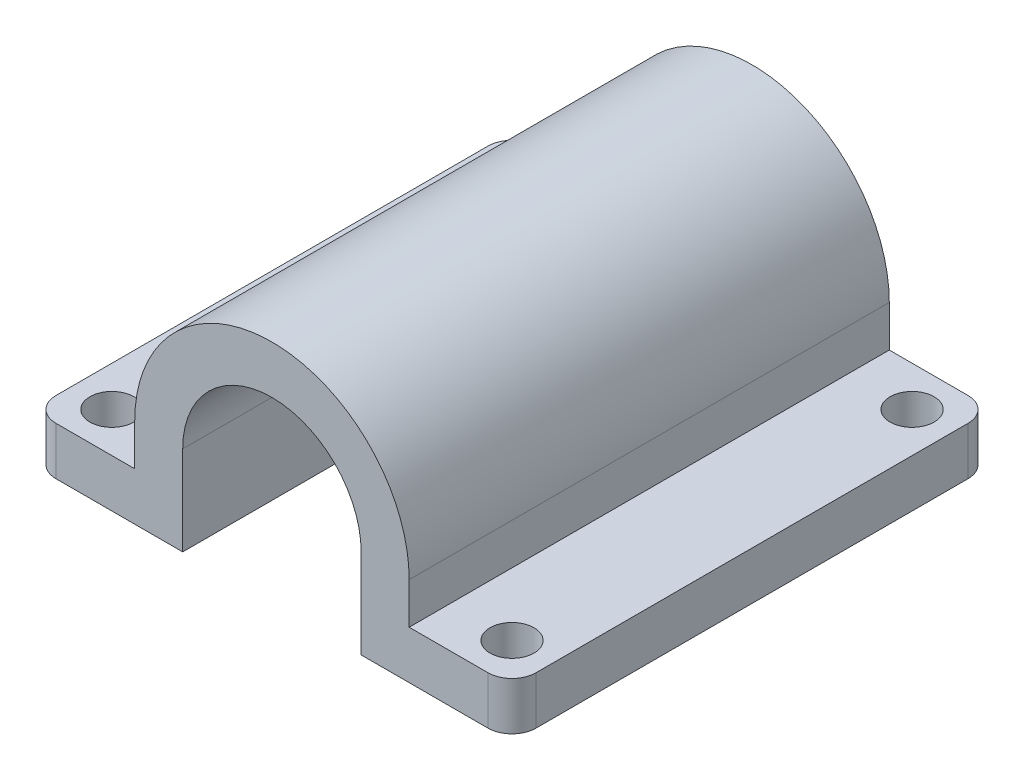
ISO-10303-21;
HEADER;
FILE_DESCRIPTION(('STEP AP214'),'2;1');
FILE_NAME('part.step','',(''),(''),'','','');
FILE_SCHEMA(('AUTOMOTIVE_DESIGN { 1 0 10303 214 1 1 1 1 }'));
ENDSEC;
DATA;
#1=APPLICATION_CONTEXT('core data for automotive mechanical design processes');
#2=APPLICATION_PROTOCOL_DEFINITION('international standard','automotive_design',2000,#1);
#3=PRODUCT_CONTEXT('',#1,'mechanical');
#4=PRODUCT('Part','Part','',(#3));
#5=PRODUCT_RELATED_PRODUCT_CATEGORY('part','',(#4));
#6=PRODUCT_DEFINITION_FORMATION('','',#4);
#7=PRODUCT_DEFINITION_CONTEXT('part definition',#1,'design');
#8=PRODUCT_DEFINITION('design','',#6,#7);
#9=PRODUCT_DEFINITION_SHAPE('','',#8);
#10=(LENGTH_UNIT() NAMED_UNIT(*) SI_UNIT(.MILLI.,.METRE.));
#11=(NAMED_UNIT(*) PLANE_ANGLE_UNIT() SI_UNIT($,.RADIAN.));
#12=(NAMED_UNIT(*) SI_UNIT($,.STERADIAN.) SOLID_ANGLE_UNIT());
#13=UNCERTAINTY_MEASURE_WITH_UNIT(LENGTH_MEASURE(1.E-05),#10,'distance_accuracy_value','');
#14=(GEOMETRIC_REPRESENTATION_CONTEXT(3) GLOBAL_UNCERTAINTY_ASSIGNED_CONTEXT((#13)) GLOBAL_UNIT_ASSIGNED_CONTEXT((#10,
#11,#12)) REPRESENTATION_CONTEXT('',''));
#15=CARTESIAN_POINT('',(0.,0.,0.));
#16=DIRECTION('',(0.,0.,1.));
#17=DIRECTION('',(1.,0.,0.));
#18=AXIS2_PLACEMENT_3D('',#15,#16,#17);
#19=CARTESIAN_POINT('',(0.,0.,60.));
#20=DIRECTION('',(0.,0.,-1.));
#21=DIRECTION('',(-1.,0.,0.));
#22=AXIS2_PLACEMENT_3D('',#19,#20,#21);
#23=CYLINDRICAL_SURFACE('',#22,11.15);
#24=CARTESIAN_POINT('',(0.,0.,0.));
#25=DIRECTION('',(0.,0.,-1.));
#26=DIRECTION('',(1.,0.,0.));
#27=AXIS2_PLACEMENT_3D('',#24,#25,#26);
#28=CIRCLE('',#27,11.15);
#29=CARTESIAN_POINT('',(-11.15,0.,0.));
#30=VERTEX_POINT('',#29);
#31=CARTESIAN_POINT('',(11.15,0.,0.));
#32=VERTEX_POINT('',#31);
#33=EDGE_CURVE('E172',#30,#32,#28,.T.);
#34=ORIENTED_EDGE('',*,*,#33,.T.);
#35=DIRECTION('',(0.,0.,-1.));
#36=VECTOR('',#35,1.);
#37=CARTESIAN_POINT('',(11.15,0.,60.));
#38=LINE('',#37,#36);
#39=CARTESIAN_POINT('',(11.15,0.,60.));
#40=VERTEX_POINT('',#39);
#41=EDGE_CURVE('E152',#40,#32,#38,.T.);
#42=ORIENTED_EDGE('',*,*,#41,.F.);
#43=CARTESIAN_POINT('',(0.,0.,60.));
#44=DIRECTION('',(0.,0.,-1.));
#45=DIRECTION('',(1.,0.,0.));
#46=AXIS2_PLACEMENT_3D('',#43,#44,#45);
#47=CIRCLE('',#46,11.15);
#48=CARTESIAN_POINT('',(-11.15,0.,60.));
#49=VERTEX_POINT('',#48);
#50=EDGE_CURVE('E160',#49,#40,#47,.T.);
#51=ORIENTED_EDGE('',*,*,#50,.F.);
#52=DIRECTION('',(0.,0.,-1.));
#53=VECTOR('',#52,1.);
#54=CARTESIAN_POINT('',(-11.15,0.,60.));
#55=LINE('',#54,#53);
#56=EDGE_CURVE('E223',#49,#30,#55,.T.);
#57=ORIENTED_EDGE('',*,*,#56,.T.);
#58=EDGE_LOOP('',(#34,#42,#51,#57));
#59=FACE_BOUND('',#58,.T.);
#60=ADVANCED_FACE('F35',(#59),#23,.F.);
#61=CARTESIAN_POINT('',(11.15,-11.15,60.));
#62=DIRECTION('',(1.,0.,0.));
#63=DIRECTION('',(0.,0.,-1.));
#64=AXIS2_PLACEMENT_3D('',#61,#62,#63);
#65=PLANE('',#64);
#66=DIRECTION('',(0.,-1.,0.));
#67=VECTOR('',#66,1.);
#68=CARTESIAN_POINT('',(11.15,-11.15,0.));
#69=LINE('',#68,#67);
#70=CARTESIAN_POINT('',(11.15,-11.15,0.));
#71=VERTEX_POINT('',#70);
#72=EDGE_CURVE('E269',#32,#71,#69,.T.);
#73=ORIENTED_EDGE('',*,*,#72,.T.);
#74=DIRECTION('',(0.,0.,-1.));
#75=VECTOR('',#74,1.);
#76=CARTESIAN_POINT('',(11.15,-11.15,60.));
#77=LINE('',#76,#75);
#78=CARTESIAN_POINT('',(11.15,-11.15,60.));
#79=VERTEX_POINT('',#78);
#80=EDGE_CURVE('E155',#79,#71,#77,.T.);
#81=ORIENTED_EDGE('',*,*,#80,.F.);
#82=DIRECTION('',(0.,-1.,0.));
#83=VECTOR('',#82,1.);
#84=CARTESIAN_POINT('',(11.15,-11.15,60.));
#85=LINE('',#84,#83);
#86=EDGE_CURVE('E148',#40,#79,#85,.T.);
#87=ORIENTED_EDGE('',*,*,#86,.F.);
#88=ORIENTED_EDGE('',*,*,#41,.T.);
#89=EDGE_LOOP('',(#73,#81,#87,#88));
#90=FACE_BOUND('',#89,.T.);
#91=ADVANCED_FACE('F150',(#90),#65,.F.);
#92=CARTESIAN_POINT('',(11.15,-11.15,60.));
#93=DIRECTION('',(0.,1.,0.));
#94=DIRECTION('',(-1.,0.,0.));
#95=AXIS2_PLACEMENT_3D('',#92,#93,#94);
#96=PLANE('',#95);
#97=CARTESIAN_POINT('',(25.,-11.15,5.));
#98=DIRECTION('',(0.,1.,0.));
#99=DIRECTION('',(0.,0.,-1.));
#100=AXIS2_PLACEMENT_3D('',#97,#98,#99);
#101=CIRCLE('',#100,2.75);
#102=CARTESIAN_POINT('',(25.,-11.15,2.25));
#103=VERTEX_POINT('',#102);
#104=EDGE_CURVE('E371',#103,#103,#101,.T.);
#105=ORIENTED_EDGE('',*,*,#104,.T.);
#106=EDGE_LOOP('',(#105));
#107=FACE_BOUND('',#106,.T.);
#108=CARTESIAN_POINT('',(25.,-11.15,55.));
#109=DIRECTION('',(0.,1.,0.));
#110=DIRECTION('',(0.,0.,1.));
#111=AXIS2_PLACEMENT_3D('',#108,#109,#110);
#112=CIRCLE('',#111,2.75);
#113=CARTESIAN_POINT('',(25.,-11.15,57.75));
#114=VERTEX_POINT('',#113);
#115=EDGE_CURVE('E374',#114,#114,#112,.T.);
#116=ORIENTED_EDGE('',*,*,#115,.T.);
#117=EDGE_LOOP('',(#116));
#118=FACE_BOUND('',#117,.T.);
#119=DIRECTION('',(1.,0.,0.));
#120=VECTOR('',#119,1.);
#121=CARTESIAN_POINT('',(11.15,-11.15,0.));
#122=LINE('',#121,#120);
#123=CARTESIAN_POINT('',(27.,-11.15,0.));
#124=VERTEX_POINT('',#123);
#125=EDGE_CURVE('E265',#71,#124,#122,.T.);
#126=ORIENTED_EDGE('',*,*,#125,.T.);
#127=CARTESIAN_POINT('',(27.,-11.15,3.));
#128=DIRECTION('',(0.,1.,0.));
#129=DIRECTION('',(-1.,0.,0.));
#130=AXIS2_PLACEMENT_3D('',#127,#128,#129);
#131=CIRCLE('',#130,3.);
#132=CARTESIAN_POINT('',(30.,-11.15,3.00000000000002));
#133=VERTEX_POINT('',#132);
#134=EDGE_CURVE('E193',#124,#133,#131,.F.);
#135=ORIENTED_EDGE('',*,*,#134,.T.);
#136=DIRECTION('',(0.,0.,-1.));
#137=VECTOR('',#136,1.);
#138=CARTESIAN_POINT('',(30.,-11.15,60.));
#139=LINE('',#138,#137);
#140=CARTESIAN_POINT('',(30.,-11.15,57.));
#141=VERTEX_POINT('',#140);
#142=EDGE_CURVE('E177',#141,#133,#139,.T.);
#143=ORIENTED_EDGE('',*,*,#142,.F.);
#144=CARTESIAN_POINT('',(27.,-11.15,57.));
#145=DIRECTION('',(0.,1.,0.));
#146=DIRECTION('',(-1.,0.,0.));
#147=AXIS2_PLACEMENT_3D('',#144,#145,#146);
#148=CIRCLE('',#147,3.);
#149=CARTESIAN_POINT('',(27.,-11.15,60.));
#150=VERTEX_POINT('',#149);
#151=EDGE_CURVE('E191',#141,#150,#148,.F.);
#152=ORIENTED_EDGE('',*,*,#151,.T.);
#153=DIRECTION('',(1.,0.,0.));
#154=VECTOR('',#153,1.);
#155=CARTESIAN_POINT('',(11.15,-11.15,60.));
#156=LINE('',#155,#154);
#157=EDGE_CURVE('E159',#79,#150,#156,.T.);
#158=ORIENTED_EDGE('',*,*,#157,.F.);
#159=ORIENTED_EDGE('',*,*,#80,.T.);
#160=EDGE_LOOP('',(#126,#135,#143,#152,#158,#159));
#161=FACE_BOUND('',#160,.T.);
#162=ADVANCED_FACE('F287',(#107,#118,#161),#96,.F.);
#163=CARTESIAN_POINT('',(30.,-11.15,60.));
#164=DIRECTION('',(-1.,0.,0.));
#165=DIRECTION('',(0.,0.,1.));
#166=AXIS2_PLACEMENT_3D('',#163,#164,#165);
#167=PLANE('',#166);
#168=ORIENTED_EDGE('',*,*,#142,.T.);
#169=DIRECTION('',(0.,1.,0.));
#170=VECTOR('',#169,1.);
#171=CARTESIAN_POINT('',(30.,-11.15,3.));
#172=LINE('',#171,#170);
#173=CARTESIAN_POINT('',(30.,-5.15,3.00000000000002));
#174=VERTEX_POINT('',#173);
#175=EDGE_CURVE('E175',#133,#174,#172,.T.);
#176=ORIENTED_EDGE('',*,*,#175,.T.);
#177=DIRECTION('',(0.,0.,-1.));
#178=VECTOR('',#177,1.);
#179=CARTESIAN_POINT('',(30.,-5.15,60.));
#180=LINE('',#179,#178);
#181=CARTESIAN_POINT('',(30.,-5.15,57.));
#182=VERTEX_POINT('',#181);
#183=EDGE_CURVE('E238',#182,#174,#180,.T.);
#184=ORIENTED_EDGE('',*,*,#183,.F.);
#185=DIRECTION('',(0.,1.,0.));
#186=VECTOR('',#185,1.);
#187=CARTESIAN_POINT('',(30.,-11.15,57.));
#188=LINE('',#187,#186);
#189=EDGE_CURVE('E173',#182,#141,#188,.F.);
#190=ORIENTED_EDGE('',*,*,#189,.T.);
#191=EDGE_LOOP('',(#168,#176,#184,#190));
#192=FACE_BOUND('',#191,.T.);
#193=ADVANCED_FACE('F244',(#192),#167,.F.);
#194=CARTESIAN_POINT('',(30.,-5.15,60.));
#195=DIRECTION('',(0.,-1.,0.));
#196=DIRECTION('',(0.,0.,-1.));
#197=AXIS2_PLACEMENT_3D('',#194,#195,#196);
#198=PLANE('',#197);
#199=CARTESIAN_POINT('',(25.,-5.15,5.));
#200=DIRECTION('',(0.,1.,0.));
#201=DIRECTION('',(0.,0.,-1.));
#202=AXIS2_PLACEMENT_3D('',#199,#200,#201);
#203=CIRCLE('',#202,2.75);
#204=CARTESIAN_POINT('',(25.,-5.15,2.25));
#205=VERTEX_POINT('',#204);
#206=EDGE_CURVE('E387',#205,#205,#203,.T.);
#207=ORIENTED_EDGE('',*,*,#206,.F.);
#208=EDGE_LOOP('',(#207));
#209=FACE_BOUND('',#208,.T.);
#210=CARTESIAN_POINT('',(25.,-5.15,55.));
#211=DIRECTION('',(0.,1.,0.));
#212=DIRECTION('',(0.,0.,1.));
#213=AXIS2_PLACEMENT_3D('',#210,#211,#212);
#214=CIRCLE('',#213,2.75);
#215=CARTESIAN_POINT('',(25.,-5.15,57.75));
#216=VERTEX_POINT('',#215);
#217=EDGE_CURVE('E377',#216,#216,#214,.T.);
#218=ORIENTED_EDGE('',*,*,#217,.F.);
#219=EDGE_LOOP('',(#218));
#220=FACE_BOUND('',#219,.T.);
#221=ORIENTED_EDGE('',*,*,#183,.T.);
#222=CARTESIAN_POINT('',(27.,-5.15,3.));
#223=DIRECTION('',(0.,-1.,0.));
#224=DIRECTION('',(0.,0.,-1.));
#225=AXIS2_PLACEMENT_3D('',#222,#223,#224);
#226=CIRCLE('',#225,3.);
#227=CARTESIAN_POINT('',(27.,-5.15,0.));
#228=VERTEX_POINT('',#227);
#229=EDGE_CURVE('E185',#174,#228,#226,.F.);
#230=ORIENTED_EDGE('',*,*,#229,.T.);
#231=DIRECTION('',(-1.,0.,0.));
#232=VECTOR('',#231,1.);
#233=CARTESIAN_POINT('',(30.,-5.15,0.));
#234=LINE('',#233,#232);
#235=CARTESIAN_POINT('',(17.15,-5.15,0.));
#236=VERTEX_POINT('',#235);
#237=EDGE_CURVE('E257',#228,#236,#234,.T.);
#238=ORIENTED_EDGE('',*,*,#237,.T.);
#239=DIRECTION('',(0.,0.,-1.));
#240=VECTOR('',#239,1.);
#241=CARTESIAN_POINT('',(17.15,-5.15,60.));
#242=LINE('',#241,#240);
#243=CARTESIAN_POINT('',(17.15,-5.15,60.));
#244=VERTEX_POINT('',#243);
#245=EDGE_CURVE('E235',#244,#236,#242,.T.);
#246=ORIENTED_EDGE('',*,*,#245,.F.);
#247=DIRECTION('',(-1.,0.,0.));
#248=VECTOR('',#247,1.);
#249=CARTESIAN_POINT('',(30.,-5.15,60.));
#250=LINE('',#249,#248);
#251=CARTESIAN_POINT('',(27.,-5.15,60.));
#252=VERTEX_POINT('',#251);
#253=EDGE_CURVE('E289',#252,#244,#250,.T.);
#254=ORIENTED_EDGE('',*,*,#253,.F.);
#255=CARTESIAN_POINT('',(27.,-5.15,57.));
#256=DIRECTION('',(0.,-1.,0.));
#257=DIRECTION('',(0.,0.,-1.));
#258=AXIS2_PLACEMENT_3D('',#255,#256,#257);
#259=CIRCLE('',#258,3.);
#260=EDGE_CURVE('E183',#252,#182,#259,.F.);
#261=ORIENTED_EDGE('',*,*,#260,.T.);
#262=EDGE_LOOP('',(#221,#230,#238,#246,#254,#261));
#263=FACE_BOUND('',#262,.T.);
#264=ADVANCED_FACE('F255',(#209,#220,#263),#198,.F.);
#265=CARTESIAN_POINT('',(17.15,-5.15,60.));
#266=DIRECTION('',(-1.,0.,0.));
#267=DIRECTION('',(0.,0.,1.));
#268=AXIS2_PLACEMENT_3D('',#265,#266,#267);
#269=PLANE('',#268);
#270=DIRECTION('',(0.,1.,0.));
#271=VECTOR('',#270,1.);
#272=CARTESIAN_POINT('',(17.15,-5.15,0.));
#273=LINE('',#272,#271);
#274=CARTESIAN_POINT('',(17.15,0.,0.));
#275=VERTEX_POINT('',#274);
#276=EDGE_CURVE('E264',#236,#275,#273,.T.);
#277=ORIENTED_EDGE('',*,*,#276,.T.);
#278=DIRECTION('',(0.,0.,-1.));
#279=VECTOR('',#278,1.);
#280=CARTESIAN_POINT('',(17.15,0.,60.));
#281=LINE('',#280,#279);
#282=CARTESIAN_POINT('',(17.15,0.,60.));
#283=VERTEX_POINT('',#282);
#284=EDGE_CURVE('E232',#283,#275,#281,.T.);
#285=ORIENTED_EDGE('',*,*,#284,.F.);
#286=DIRECTION('',(0.,1.,0.));
#287=VECTOR('',#286,1.);
#288=CARTESIAN_POINT('',(17.15,-5.15,60.));
#289=LINE('',#288,#287);
#290=EDGE_CURVE('E291',#244,#283,#289,.T.);
#291=ORIENTED_EDGE('',*,*,#290,.F.);
#292=ORIENTED_EDGE('',*,*,#245,.T.);
#293=EDGE_LOOP('',(#277,#285,#291,#292));
#294=FACE_BOUND('',#293,.T.);
#295=ADVANCED_FACE('F351',(#294),#269,.F.);
#296=CARTESIAN_POINT('',(0.,0.,60.));
#297=DIRECTION('',(0.,0.,-1.));
#298=DIRECTION('',(-1.,0.,0.));
#299=AXIS2_PLACEMENT_3D('',#296,#297,#298);
#300=CYLINDRICAL_SURFACE('',#299,17.15);
#301=CARTESIAN_POINT('',(0.,0.,0.));
#302=DIRECTION('',(0.,0.,1.));
#303=DIRECTION('',(1.,0.,0.));
#304=AXIS2_PLACEMENT_3D('',#301,#302,#303);
#305=CIRCLE('',#304,17.15);
#306=CARTESIAN_POINT('',(-17.15,0.,0.));
#307=VERTEX_POINT('',#306);
#308=EDGE_CURVE('E267',#275,#307,#305,.T.);
#309=ORIENTED_EDGE('',*,*,#308,.T.);
#310=DIRECTION('',(0.,0.,-1.));
#311=VECTOR('',#310,1.);
#312=CARTESIAN_POINT('',(-17.15,0.,60.));
#313=LINE('',#312,#311);
#314=CARTESIAN_POINT('',(-17.15,0.,60.));
#315=VERTEX_POINT('',#314);
#316=EDGE_CURVE('E229',#315,#307,#313,.T.);
#317=ORIENTED_EDGE('',*,*,#316,.F.);
#318=CARTESIAN_POINT('',(0.,0.,60.));
#319=DIRECTION('',(0.,0.,1.));
#320=DIRECTION('',(1.,0.,0.));
#321=AXIS2_PLACEMENT_3D('',#318,#319,#320);
#322=CIRCLE('',#321,17.15);
#323=EDGE_CURVE('E295',#283,#315,#322,.T.);
#324=ORIENTED_EDGE('',*,*,#323,.F.);
#325=ORIENTED_EDGE('',*,*,#284,.T.);
#326=EDGE_LOOP('',(#309,#317,#324,#325));
#327=FACE_BOUND('',#326,.T.);
#328=ADVANCED_FACE('F316',(#327),#300,.T.);
#329=CARTESIAN_POINT('',(-17.15,-5.15,60.));
#330=DIRECTION('',(1.,0.,0.));
#331=DIRECTION('',(0.,0.,-1.));
#332=AXIS2_PLACEMENT_3D('',#329,#330,#331);
#333=PLANE('',#332);
#334=DIRECTION('',(0.,-1.,0.));
#335=VECTOR('',#334,1.);
#336=CARTESIAN_POINT('',(-17.15,-5.15,0.));
#337=LINE('',#336,#335);
#338=CARTESIAN_POINT('',(-17.15,-5.15,0.));
#339=VERTEX_POINT('',#338);
#340=EDGE_CURVE('E274',#307,#339,#337,.T.);
#341=ORIENTED_EDGE('',*,*,#340,.T.);
#342=DIRECTION('',(0.,0.,-1.));
#343=VECTOR('',#342,1.);
#344=CARTESIAN_POINT('',(-17.15,-5.15,60.));
#345=LINE('',#344,#343);
#346=CARTESIAN_POINT('',(-17.15,-5.15,60.));
#347=VERTEX_POINT('',#346);
#348=EDGE_CURVE('E220',#347,#339,#345,.T.);
#349=ORIENTED_EDGE('',*,*,#348,.F.);
#350=DIRECTION('',(0.,-1.,0.));
#351=VECTOR('',#350,1.);
#352=CARTESIAN_POINT('',(-17.15,-5.15,60.));
#353=LINE('',#352,#351);
#354=EDGE_CURVE('E297',#315,#347,#353,.T.);
#355=ORIENTED_EDGE('',*,*,#354,.F.);
#356=ORIENTED_EDGE('',*,*,#316,.T.);
#357=EDGE_LOOP('',(#341,#349,#355,#356));
#358=FACE_BOUND('',#357,.T.);
#359=ADVANCED_FACE('F308',(#358),#333,.F.);
#360=CARTESIAN_POINT('',(-30.,-5.15,60.));
#361=DIRECTION('',(0.,-1.,0.));
#362=DIRECTION('',(0.,0.,-1.));
#363=AXIS2_PLACEMENT_3D('',#360,#361,#362);
#364=PLANE('',#363);
#365=CARTESIAN_POINT('',(-25.,-5.15,55.));
#366=DIRECTION('',(0.,1.,0.));
#367=DIRECTION('',(0.,0.,-1.));
#368=AXIS2_PLACEMENT_3D('',#365,#366,#367);
#369=CIRCLE('',#368,2.75);
#370=CARTESIAN_POINT('',(-25.,-5.15,52.25));
#371=VERTEX_POINT('',#370);
#372=EDGE_CURVE('E376',#371,#371,#369,.T.);
#373=ORIENTED_EDGE('',*,*,#372,.F.);
#374=EDGE_LOOP('',(#373));
#375=FACE_BOUND('',#374,.T.);
#376=CARTESIAN_POINT('',(-25.,-5.15,5.));
#377=DIRECTION('',(0.,1.,0.));
#378=DIRECTION('',(0.,0.,1.));
#379=AXIS2_PLACEMENT_3D('',#376,#377,#378);
#380=CIRCLE('',#379,2.75);
#381=CARTESIAN_POINT('',(-25.,-5.15,7.75));
#382=VERTEX_POINT('',#381);
#383=EDGE_CURVE('E392',#382,#382,#380,.T.);
#384=ORIENTED_EDGE('',*,*,#383,.F.);
#385=EDGE_LOOP('',(#384));
#386=FACE_BOUND('',#385,.T.);
#387=DIRECTION('',(0.,0.,-1.));
#388=VECTOR('',#387,1.);
#389=CARTESIAN_POINT('',(-30.,-5.15,60.));
#390=LINE('',#389,#388);
#391=CARTESIAN_POINT('',(-30.,-5.15,57.));
#392=VERTEX_POINT('',#391);
#393=CARTESIAN_POINT('',(-30.,-5.15,3.00000000000002));
#394=VERTEX_POINT('',#393);
#395=EDGE_CURVE('E212',#392,#394,#390,.T.);
#396=ORIENTED_EDGE('',*,*,#395,.F.);
#397=CARTESIAN_POINT('',(-27.,-5.15,57.));
#398=DIRECTION('',(0.,-1.,0.));
#399=DIRECTION('',(0.,0.,-1.));
#400=AXIS2_PLACEMENT_3D('',#397,#398,#399);
#401=CIRCLE('',#400,3.);
#402=CARTESIAN_POINT('',(-27.,-5.15,60.));
#403=VERTEX_POINT('',#402);
#404=EDGE_CURVE('E11',#392,#403,#401,.F.);
#405=ORIENTED_EDGE('',*,*,#404,.T.);
#406=DIRECTION('',(-1.,0.,0.));
#407=VECTOR('',#406,1.);
#408=CARTESIAN_POINT('',(-30.,-5.15,60.));
#409=LINE('',#408,#407);
#410=EDGE_CURVE('E282',#347,#403,#409,.T.);
#411=ORIENTED_EDGE('',*,*,#410,.F.);
#412=ORIENTED_EDGE('',*,*,#348,.T.);
#413=DIRECTION('',(-1.,0.,0.));
#414=VECTOR('',#413,1.);
#415=CARTESIAN_POINT('',(-30.,-5.15,0.));
#416=LINE('',#415,#414);
#417=CARTESIAN_POINT('',(-27.,-5.15,0.));
#418=VERTEX_POINT('',#417);
#419=EDGE_CURVE('E276',#339,#418,#416,.T.);
#420=ORIENTED_EDGE('',*,*,#419,.T.);
#421=CARTESIAN_POINT('',(-27.,-5.15,3.));
#422=DIRECTION('',(0.,-1.,0.));
#423=DIRECTION('',(0.,0.,-1.));
#424=AXIS2_PLACEMENT_3D('',#421,#422,#423);
#425=CIRCLE('',#424,3.);
#426=EDGE_CURVE('E43',#418,#394,#425,.F.);
#427=ORIENTED_EDGE('',*,*,#426,.T.);
#428=EDGE_LOOP('',(#396,#405,#411,#412,#420,#427));
#429=FACE_BOUND('',#428,.T.);
#430=ADVANCED_FACE('F306',(#375,#386,#429),#364,.F.);
#431=CARTESIAN_POINT('',(-30.,-11.15,60.));
#432=DIRECTION('',(1.,0.,0.));
#433=DIRECTION('',(0.,0.,-1.));
#434=AXIS2_PLACEMENT_3D('',#431,#432,#433);
#435=PLANE('',#434);
#436=DIRECTION('',(0.,0.,-1.));
#437=VECTOR('',#436,1.);
#438=CARTESIAN_POINT('',(-30.,-11.15,60.));
#439=LINE('',#438,#437);
#440=CARTESIAN_POINT('',(-30.,-11.15,57.));
#441=VERTEX_POINT('',#440);
#442=CARTESIAN_POINT('',(-30.,-11.15,3.00000000000002));
#443=VERTEX_POINT('',#442);
#444=EDGE_CURVE('E211',#441,#443,#439,.T.);
#445=ORIENTED_EDGE('',*,*,#444,.F.);
#446=DIRECTION('',(0.,-1.,0.));
#447=VECTOR('',#446,1.);
#448=CARTESIAN_POINT('',(-30.,-5.15,57.));
#449=LINE('',#448,#447);
#450=EDGE_CURVE('E56',#441,#392,#449,.F.);
#451=ORIENTED_EDGE('',*,*,#450,.T.);
#452=ORIENTED_EDGE('',*,*,#395,.T.);
#453=DIRECTION('',(0.,-1.,0.));
#454=VECTOR('',#453,1.);
#455=CARTESIAN_POINT('',(-30.,-11.15,3.));
#456=LINE('',#455,#454);
#457=EDGE_CURVE('E205',#394,#443,#456,.T.);
#458=ORIENTED_EDGE('',*,*,#457,.T.);
#459=EDGE_LOOP('',(#445,#451,#452,#458));
#460=FACE_BOUND('',#459,.T.);
#461=ADVANCED_FACE('F210',(#460),#435,.F.);
#462=CARTESIAN_POINT('',(-30.,-11.15,60.));
#463=DIRECTION('',(0.,1.,0.));
#464=DIRECTION('',(0.,0.,1.));
#465=AXIS2_PLACEMENT_3D('',#462,#463,#464);
#466=PLANE('',#465);
#467=CARTESIAN_POINT('',(-25.,-11.15,55.));
#468=DIRECTION('',(0.,1.,0.));
#469=DIRECTION('',(0.,0.,-1.));
#470=AXIS2_PLACEMENT_3D('',#467,#468,#469);
#471=CIRCLE('',#470,2.75);
#472=CARTESIAN_POINT('',(-25.,-11.15,52.25));
#473=VERTEX_POINT('',#472);
#474=EDGE_CURVE('E380',#473,#473,#471,.T.);
#475=ORIENTED_EDGE('',*,*,#474,.T.);
#476=EDGE_LOOP('',(#475));
#477=FACE_BOUND('',#476,.T.);
#478=CARTESIAN_POINT('',(-25.,-11.15,5.));
#479=DIRECTION('',(0.,1.,0.));
#480=DIRECTION('',(0.,0.,1.));
#481=AXIS2_PLACEMENT_3D('',#478,#479,#480);
#482=CIRCLE('',#481,2.75);
#483=CARTESIAN_POINT('',(-25.,-11.15,7.75));
#484=VERTEX_POINT('',#483);
#485=EDGE_CURVE('E286',#484,#484,#482,.T.);
#486=ORIENTED_EDGE('',*,*,#485,.T.);
#487=EDGE_LOOP('',(#486));
#488=FACE_BOUND('',#487,.T.);
#489=DIRECTION('',(1.,0.,0.));
#490=VECTOR('',#489,1.);
#491=CARTESIAN_POINT('',(-30.,-11.15,60.));
#492=LINE('',#491,#490);
#493=CARTESIAN_POINT('',(-27.,-11.15,60.));
#494=VERTEX_POINT('',#493);
#495=CARTESIAN_POINT('',(-11.15,-11.15,60.));
#496=VERTEX_POINT('',#495);
#497=EDGE_CURVE('E280',#494,#496,#492,.T.);
#498=ORIENTED_EDGE('',*,*,#497,.F.);
#499=CARTESIAN_POINT('',(-27.,-11.15,57.));
#500=DIRECTION('',(0.,1.,0.));
#501=DIRECTION('',(0.,0.,1.));
#502=AXIS2_PLACEMENT_3D('',#499,#500,#501);
#503=CIRCLE('',#502,3.);
#504=EDGE_CURVE('E203',#494,#441,#503,.F.);
#505=ORIENTED_EDGE('',*,*,#504,.T.);
#506=ORIENTED_EDGE('',*,*,#444,.T.);
#507=CARTESIAN_POINT('',(-27.,-11.15,3.));
#508=DIRECTION('',(0.,1.,0.));
#509=DIRECTION('',(0.,0.,1.));
#510=AXIS2_PLACEMENT_3D('',#507,#508,#509);
#511=CIRCLE('',#510,3.);
#512=CARTESIAN_POINT('',(-27.,-11.15,0.));
#513=VERTEX_POINT('',#512);
#514=EDGE_CURVE('E201',#443,#513,#511,.F.);
#515=ORIENTED_EDGE('',*,*,#514,.T.);
#516=DIRECTION('',(1.,0.,0.));
#517=VECTOR('',#516,1.);
#518=CARTESIAN_POINT('',(-30.,-11.15,0.));
#519=LINE('',#518,#517);
#520=CARTESIAN_POINT('',(-11.15,-11.15,0.));
#521=VERTEX_POINT('',#520);
#522=EDGE_CURVE('E278',#513,#521,#519,.T.);
#523=ORIENTED_EDGE('',*,*,#522,.T.);
#524=DIRECTION('',(0.,0.,-1.));
#525=VECTOR('',#524,1.);
#526=CARTESIAN_POINT('',(-11.15,-11.15,60.));
#527=LINE('',#526,#525);
#528=EDGE_CURVE('E218',#496,#521,#527,.T.);
#529=ORIENTED_EDGE('',*,*,#528,.F.);
#530=EDGE_LOOP('',(#498,#505,#506,#515,#523,#529));
#531=FACE_BOUND('',#530,.T.);
#532=ADVANCED_FACE('F216',(#477,#488,#531),#466,.F.);
#533=CARTESIAN_POINT('',(-11.15,0.,60.));
#534=DIRECTION('',(-1.,0.,0.));
#535=DIRECTION('',(0.,0.,1.));
#536=AXIS2_PLACEMENT_3D('',#533,#534,#535);
#537=PLANE('',#536);
#538=DIRECTION('',(0.,1.,0.));
#539=VECTOR('',#538,1.);
#540=CARTESIAN_POINT('',(-11.15,0.,0.));
#541=LINE('',#540,#539);
#542=EDGE_CURVE('E169',#521,#30,#541,.T.);
#543=ORIENTED_EDGE('',*,*,#542,.T.);
#544=ORIENTED_EDGE('',*,*,#56,.F.);
#545=DIRECTION('',(0.,1.,0.));
#546=VECTOR('',#545,1.);
#547=CARTESIAN_POINT('',(-11.15,0.,60.));
#548=LINE('',#547,#546);
#549=EDGE_CURVE('E165',#496,#49,#548,.T.);
#550=ORIENTED_EDGE('',*,*,#549,.F.);
#551=ORIENTED_EDGE('',*,*,#528,.T.);
#552=EDGE_LOOP('',(#543,#544,#550,#551));
#553=FACE_BOUND('',#552,.T.);
#554=ADVANCED_FACE('F420',(#553),#537,.F.);
#555=CARTESIAN_POINT('',(0.,0.,60.));
#556=DIRECTION('',(0.,0.,1.));
#557=DIRECTION('',(1.,0.,0.));
#558=AXIS2_PLACEMENT_3D('',#555,#556,#557);
#559=PLANE('',#558);
#560=ORIENTED_EDGE('',*,*,#157,.T.);
#561=DIRECTION('',(0.,1.,0.));
#562=VECTOR('',#561,1.);
#563=CARTESIAN_POINT('',(27.,-5.15,60.));
#564=LINE('',#563,#562);
#565=EDGE_CURVE('E198',#150,#252,#564,.T.);
#566=ORIENTED_EDGE('',*,*,#565,.T.);
#567=ORIENTED_EDGE('',*,*,#253,.T.);
#568=ORIENTED_EDGE('',*,*,#290,.T.);
#569=ORIENTED_EDGE('',*,*,#323,.T.);
#570=ORIENTED_EDGE('',*,*,#354,.T.);
#571=ORIENTED_EDGE('',*,*,#410,.T.);
#572=DIRECTION('',(0.,-1.,0.));
#573=VECTOR('',#572,1.);
#574=CARTESIAN_POINT('',(-27.,-11.15,60.));
#575=LINE('',#574,#573);
#576=EDGE_CURVE('E195',#403,#494,#575,.T.);
#577=ORIENTED_EDGE('',*,*,#576,.T.);
#578=ORIENTED_EDGE('',*,*,#497,.T.);
#579=ORIENTED_EDGE('',*,*,#549,.T.);
#580=ORIENTED_EDGE('',*,*,#50,.T.);
#581=ORIENTED_EDGE('',*,*,#86,.T.);
#582=EDGE_LOOP('',(#560,#566,#567,#568,#569,#570,#571,#577,#578,#579,#580,#581));
#583=FACE_BOUND('',#582,.T.);
#584=ADVANCED_FACE('F163',(#583),#559,.T.);
#585=CARTESIAN_POINT('',(0.,0.,0.));
#586=DIRECTION('',(0.,0.,1.));
#587=DIRECTION('',(1.,0.,0.));
#588=AXIS2_PLACEMENT_3D('',#585,#586,#587);
#589=PLANE('',#588);
#590=ORIENTED_EDGE('',*,*,#237,.F.);
#591=DIRECTION('',(0.,1.,0.));
#592=VECTOR('',#591,1.);
#593=CARTESIAN_POINT('',(27.,0.,0.));
#594=LINE('',#593,#592);
#595=EDGE_CURVE('E189',#228,#124,#594,.F.);
#596=ORIENTED_EDGE('',*,*,#595,.T.);
#597=ORIENTED_EDGE('',*,*,#125,.F.);
#598=ORIENTED_EDGE('',*,*,#72,.F.);
#599=ORIENTED_EDGE('',*,*,#33,.F.);
#600=ORIENTED_EDGE('',*,*,#542,.F.);
#601=ORIENTED_EDGE('',*,*,#522,.F.);
#602=DIRECTION('',(0.,-1.,0.));
#603=VECTOR('',#602,1.);
#604=CARTESIAN_POINT('',(-27.,0.,0.));
#605=LINE('',#604,#603);
#606=EDGE_CURVE('E187',#513,#418,#605,.F.);
#607=ORIENTED_EDGE('',*,*,#606,.T.);
#608=ORIENTED_EDGE('',*,*,#419,.F.);
#609=ORIENTED_EDGE('',*,*,#340,.F.);
#610=ORIENTED_EDGE('',*,*,#308,.F.);
#611=ORIENTED_EDGE('',*,*,#276,.F.);
#612=EDGE_LOOP('',(#590,#596,#597,#598,#599,#600,#601,#607,#608,#609,#610,#611));
#613=FACE_BOUND('',#612,.T.);
#614=ADVANCED_FACE('F260',(#613),#589,.F.);
#615=CARTESIAN_POINT('',(-25.,-11.15,5.));
#616=DIRECTION('',(0.,1.,0.));
#617=DIRECTION('',(0.,0.,1.));
#618=AXIS2_PLACEMENT_3D('',#615,#616,#617);
#619=CYLINDRICAL_SURFACE('',#618,2.75);
#620=ORIENTED_EDGE('',*,*,#485,.F.);
#621=EDGE_LOOP('',(#620));
#622=FACE_BOUND('',#621,.T.);
#623=ORIENTED_EDGE('',*,*,#383,.T.);
#624=EDGE_LOOP('',(#623));
#625=FACE_BOUND('',#624,.T.);
#626=ADVANCED_FACE('F405',(#622,#625),#619,.F.);
#627=CARTESIAN_POINT('',(-25.,-11.15,55.));
#628=DIRECTION('',(0.,1.,0.));
#629=DIRECTION('',(0.,0.,1.));
#630=AXIS2_PLACEMENT_3D('',#627,#628,#629);
#631=CYLINDRICAL_SURFACE('',#630,2.75);
#632=ORIENTED_EDGE('',*,*,#474,.F.);
#633=EDGE_LOOP('',(#632));
#634=FACE_BOUND('',#633,.T.);
#635=ORIENTED_EDGE('',*,*,#372,.T.);
#636=EDGE_LOOP('',(#635));
#637=FACE_BOUND('',#636,.T.);
#638=ADVANCED_FACE('F401',(#634,#637),#631,.F.);
#639=CARTESIAN_POINT('',(25.,-11.15,55.));
#640=DIRECTION('',(0.,1.,0.));
#641=DIRECTION('',(0.,0.,1.));
#642=AXIS2_PLACEMENT_3D('',#639,#640,#641);
#643=CYLINDRICAL_SURFACE('',#642,2.75);
#644=ORIENTED_EDGE('',*,*,#115,.F.);
#645=EDGE_LOOP('',(#644));
#646=FACE_BOUND('',#645,.T.);
#647=ORIENTED_EDGE('',*,*,#217,.T.);
#648=EDGE_LOOP('',(#647));
#649=FACE_BOUND('',#648,.T.);
#650=ADVANCED_FACE('F404',(#646,#649),#643,.F.);
#651=CARTESIAN_POINT('',(25.,-11.15,5.));
#652=DIRECTION('',(0.,1.,0.));
#653=DIRECTION('',(0.,0.,1.));
#654=AXIS2_PLACEMENT_3D('',#651,#652,#653);
#655=CYLINDRICAL_SURFACE('',#654,2.75);
#656=ORIENTED_EDGE('',*,*,#104,.F.);
#657=EDGE_LOOP('',(#656));
#658=FACE_BOUND('',#657,.T.);
#659=ORIENTED_EDGE('',*,*,#206,.T.);
#660=EDGE_LOOP('',(#659));
#661=FACE_BOUND('',#660,.T.);
#662=ADVANCED_FACE('F332',(#658,#661),#655,.F.);
#663=CARTESIAN_POINT('',(27.,-11.15,3.));
#664=DIRECTION('',(0.,1.,0.));
#665=DIRECTION('',(0.,0.,1.));
#666=AXIS2_PLACEMENT_3D('',#663,#664,#665);
#667=CYLINDRICAL_SURFACE('',#666,3.);
#668=ORIENTED_EDGE('',*,*,#134,.F.);
#669=ORIENTED_EDGE('',*,*,#595,.F.);
#670=ORIENTED_EDGE('',*,*,#229,.F.);
#671=ORIENTED_EDGE('',*,*,#175,.F.);
#672=EDGE_LOOP('',(#668,#669,#670,#671));
#673=FACE_BOUND('',#672,.T.);
#674=ADVANCED_FACE('F251',(#673),#667,.T.);
#675=CARTESIAN_POINT('',(27.,0.,57.));
#676=DIRECTION('',(0.,-1.,0.));
#677=DIRECTION('',(0.,0.,-1.));
#678=AXIS2_PLACEMENT_3D('',#675,#676,#677);
#679=CYLINDRICAL_SURFACE('',#678,3.);
#680=ORIENTED_EDGE('',*,*,#151,.F.);
#681=ORIENTED_EDGE('',*,*,#189,.F.);
#682=ORIENTED_EDGE('',*,*,#260,.F.);
#683=ORIENTED_EDGE('',*,*,#565,.F.);
#684=EDGE_LOOP('',(#680,#681,#682,#683));
#685=FACE_BOUND('',#684,.T.);
#686=ADVANCED_FACE('F331',(#685),#679,.T.);
#687=CARTESIAN_POINT('',(-27.,0.,57.));
#688=DIRECTION('',(0.,1.,0.));
#689=DIRECTION('',(0.,0.,1.));
#690=AXIS2_PLACEMENT_3D('',#687,#688,#689);
#691=CYLINDRICAL_SURFACE('',#690,3.);
#692=ORIENTED_EDGE('',*,*,#404,.F.);
#693=ORIENTED_EDGE('',*,*,#450,.F.);
#694=ORIENTED_EDGE('',*,*,#504,.F.);
#695=ORIENTED_EDGE('',*,*,#576,.F.);
#696=EDGE_LOOP('',(#692,#693,#694,#695));
#697=FACE_BOUND('',#696,.T.);
#698=ADVANCED_FACE('F305',(#697),#691,.T.);
#699=CARTESIAN_POINT('',(-27.,-11.15,3.));
#700=DIRECTION('',(0.,-1.,0.));
#701=DIRECTION('',(0.,0.,-1.));
#702=AXIS2_PLACEMENT_3D('',#699,#700,#701);
#703=CYLINDRICAL_SURFACE('',#702,3.);
#704=ORIENTED_EDGE('',*,*,#426,.F.);
#705=ORIENTED_EDGE('',*,*,#606,.F.);
#706=ORIENTED_EDGE('',*,*,#514,.F.);
#707=ORIENTED_EDGE('',*,*,#457,.F.);
#708=EDGE_LOOP('',(#704,#705,#706,#707));
#709=FACE_BOUND('',#708,.T.);
#710=ADVANCED_FACE('F37',(#709),#703,.T.);
#711=CLOSED_SHELL('',(#60,#91,#162,#193,#264,#295,#328,#359,#430,#461,#532,#554,#584,#614,#626,
#638,#650,#662,#674,#686,#698,#710));
#712=MANIFOLD_SOLID_BREP('B2',#711);
#713=ADVANCED_BREP_SHAPE_REPRESENTATION('',(#18,#712),#14);
#714=SHAPE_DEFINITION_REPRESENTATION(#9,#713);
ENDSEC;
END-ISO-10303-21;
